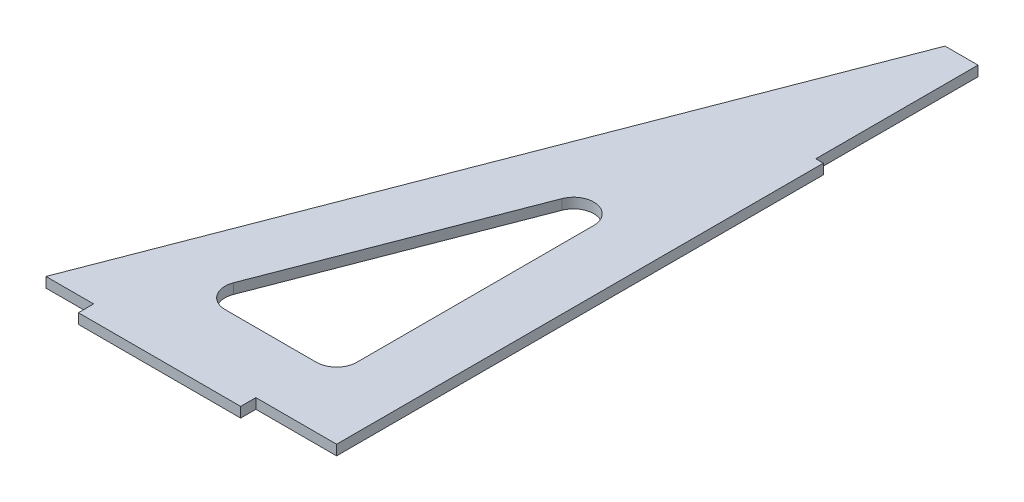
ISO-10303-21;
HEADER;
FILE_DESCRIPTION(('STEP AP214'),'2;1');
FILE_NAME('part.step','',(''),(''),'','','');
FILE_SCHEMA(('AUTOMOTIVE_DESIGN { 1 0 10303 214 1 1 1 1 }'));
ENDSEC;
DATA;
#1=APPLICATION_CONTEXT('core data for automotive mechanical design processes');
#2=APPLICATION_PROTOCOL_DEFINITION('international standard','automotive_design',2000,#1);
#3=PRODUCT_CONTEXT('',#1,'mechanical');
#4=PRODUCT('Part','Part','',(#3));
#5=PRODUCT_RELATED_PRODUCT_CATEGORY('part','',(#4));
#6=PRODUCT_DEFINITION_FORMATION('','',#4);
#7=PRODUCT_DEFINITION_CONTEXT('part definition',#1,'design');
#8=PRODUCT_DEFINITION('design','',#6,#7);
#9=PRODUCT_DEFINITION_SHAPE('','',#8);
#10=(LENGTH_UNIT() NAMED_UNIT(*) SI_UNIT(.MILLI.,.METRE.));
#11=(NAMED_UNIT(*) PLANE_ANGLE_UNIT() SI_UNIT($,.RADIAN.));
#12=(NAMED_UNIT(*) SI_UNIT($,.STERADIAN.) SOLID_ANGLE_UNIT());
#13=UNCERTAINTY_MEASURE_WITH_UNIT(LENGTH_MEASURE(1.E-05),#10,'distance_accuracy_value','');
#14=(GEOMETRIC_REPRESENTATION_CONTEXT(3) GLOBAL_UNCERTAINTY_ASSIGNED_CONTEXT((#13)) GLOBAL_UNIT_ASSIGNED_CONTEXT((#10,
#11,#12)) REPRESENTATION_CONTEXT('',''));
#15=CARTESIAN_POINT('',(0.,0.,0.));
#16=DIRECTION('',(0.,0.,1.));
#17=DIRECTION('',(1.,0.,0.));
#18=AXIS2_PLACEMENT_3D('',#15,#16,#17);
#19=CARTESIAN_POINT('',(0.,3.175,0.));
#20=DIRECTION('',(0.,0.,-1.));
#21=DIRECTION('',(-1.,0.,0.));
#22=AXIS2_PLACEMENT_3D('',#19,#20,#21);
#23=PLANE('',#22);
#24=DIRECTION('',(0.,1.,0.));
#25=VECTOR('',#24,1.);
#26=CARTESIAN_POINT('',(-25.273,0.,0.));
#27=LINE('',#26,#25);
#28=CARTESIAN_POINT('',(-25.273,0.,0.));
#29=VERTEX_POINT('',#28);
#30=CARTESIAN_POINT('',(-25.273,3.175,0.));
#31=VERTEX_POINT('',#30);
#32=EDGE_CURVE('E276',#29,#31,#27,.T.);
#33=ORIENTED_EDGE('',*,*,#32,.F.);
#34=DIRECTION('',(1.,0.,0.));
#35=VECTOR('',#34,1.);
#36=CARTESIAN_POINT('',(0.,0.,0.));
#37=LINE('',#36,#35);
#38=CARTESIAN_POINT('',(0.,0.,0.));
#39=VERTEX_POINT('',#38);
#40=EDGE_CURVE('E177',#29,#39,#37,.T.);
#41=ORIENTED_EDGE('',*,*,#40,.T.);
#42=DIRECTION('',(0.,-1.,0.));
#43=VECTOR('',#42,1.);
#44=CARTESIAN_POINT('',(0.,3.175,0.));
#45=LINE('',#44,#43);
#46=CARTESIAN_POINT('',(0.,3.175,0.));
#47=VERTEX_POINT('',#46);
#48=EDGE_CURVE('E187',#47,#39,#45,.T.);
#49=ORIENTED_EDGE('',*,*,#48,.F.);
#50=DIRECTION('',(1.,0.,0.));
#51=VECTOR('',#50,1.);
#52=CARTESIAN_POINT('',(0.,3.175,0.));
#53=LINE('',#52,#51);
#54=EDGE_CURVE('E63',#31,#47,#53,.T.);
#55=ORIENTED_EDGE('',*,*,#54,.F.);
#56=EDGE_LOOP('',(#33,#41,#49,#55));
#57=FACE_BOUND('',#56,.T.);
#58=ADVANCED_FACE('F40',(#57),#23,.F.);
#59=DIRECTION('',(0.,-1.,0.));
#60=VECTOR('',#59,1.);
#61=CARTESIAN_POINT('',(-76.073,0.,0.));
#62=LINE('',#61,#60);
#63=CARTESIAN_POINT('',(-76.073,3.175,0.));
#64=VERTEX_POINT('',#63);
#65=CARTESIAN_POINT('',(-76.073,0.,0.));
#66=VERTEX_POINT('',#65);
#67=EDGE_CURVE('E278',#64,#66,#62,.T.);
#68=ORIENTED_EDGE('',*,*,#67,.F.);
#69=CARTESIAN_POINT('',(-90.9828,3.175,0.));
#70=VERTEX_POINT('',#69);
#71=EDGE_CURVE('E191',#70,#64,#53,.T.);
#72=ORIENTED_EDGE('',*,*,#71,.F.);
#73=DIRECTION('',(0.,-1.,0.));
#74=VECTOR('',#73,1.);
#75=CARTESIAN_POINT('',(-90.9828,3.175,0.));
#76=LINE('',#75,#74);
#77=CARTESIAN_POINT('',(-90.9828,0.,0.));
#78=VERTEX_POINT('',#77);
#79=EDGE_CURVE('E190',#70,#78,#76,.T.);
#80=ORIENTED_EDGE('',*,*,#79,.T.);
#81=EDGE_CURVE('E184',#78,#66,#37,.T.);
#82=ORIENTED_EDGE('',*,*,#81,.T.);
#83=EDGE_LOOP('',(#68,#72,#80,#82));
#84=FACE_BOUND('',#83,.T.);
#85=ADVANCED_FACE('F320',(#84),#23,.F.);
#86=CARTESIAN_POINT('',(0.,3.175,-203.2));
#87=DIRECTION('',(-1.,0.,0.));
#88=DIRECTION('',(0.,0.,1.));
#89=AXIS2_PLACEMENT_3D('',#86,#87,#88);
#90=PLANE('',#89);
#91=DIRECTION('',(0.,0.,-1.));
#92=VECTOR('',#91,1.);
#93=CARTESIAN_POINT('',(0.,0.,-203.2));
#94=LINE('',#93,#92);
#95=CARTESIAN_POINT('',(0.,0.,-152.4));
#96=VERTEX_POINT('',#95);
#97=EDGE_CURVE('E175',#39,#96,#94,.T.);
#98=ORIENTED_EDGE('',*,*,#97,.T.);
#99=DIRECTION('',(0.,1.,0.));
#100=VECTOR('',#99,1.);
#101=CARTESIAN_POINT('',(0.,0.,-152.4));
#102=LINE('',#101,#100);
#103=CARTESIAN_POINT('',(0.,3.175,-152.4));
#104=VERTEX_POINT('',#103);
#105=EDGE_CURVE('E275',#96,#104,#102,.T.);
#106=ORIENTED_EDGE('',*,*,#105,.T.);
#107=DIRECTION('',(0.,0.,-1.));
#108=VECTOR('',#107,1.);
#109=CARTESIAN_POINT('',(0.,3.175,-203.2));
#110=LINE('',#109,#108);
#111=EDGE_CURVE('E186',#47,#104,#110,.T.);
#112=ORIENTED_EDGE('',*,*,#111,.F.);
#113=ORIENTED_EDGE('',*,*,#48,.T.);
#114=EDGE_LOOP('',(#98,#106,#112,#113));
#115=FACE_BOUND('',#114,.T.);
#116=ADVANCED_FACE('F274',(#115),#90,.F.);
#117=CARTESIAN_POINT('',(-12.7,3.175,-203.2));
#118=DIRECTION('',(0.,0.,1.));
#119=DIRECTION('',(1.,0.,0.));
#120=AXIS2_PLACEMENT_3D('',#117,#118,#119);
#121=PLANE('',#120);
#122=DIRECTION('',(-1.,0.,0.));
#123=VECTOR('',#122,1.);
#124=CARTESIAN_POINT('',(-12.7,3.175,-203.2));
#125=LINE('',#124,#123);
#126=CARTESIAN_POINT('',(-2.38125,3.175,-203.2));
#127=VERTEX_POINT('',#126);
#128=CARTESIAN_POINT('',(-12.7,3.175,-203.2));
#129=VERTEX_POINT('',#128);
#130=EDGE_CURVE('E168',#127,#129,#125,.T.);
#131=ORIENTED_EDGE('',*,*,#130,.F.);
#132=DIRECTION('',(0.,1.,0.));
#133=VECTOR('',#132,1.);
#134=CARTESIAN_POINT('',(-2.38125,0.,-203.2));
#135=LINE('',#134,#133);
#136=CARTESIAN_POINT('',(-2.38125,0.,-203.2));
#137=VERTEX_POINT('',#136);
#138=EDGE_CURVE('E155',#137,#127,#135,.T.);
#139=ORIENTED_EDGE('',*,*,#138,.F.);
#140=DIRECTION('',(-1.,0.,0.));
#141=VECTOR('',#140,1.);
#142=CARTESIAN_POINT('',(-12.7,0.,-203.2));
#143=LINE('',#142,#141);
#144=CARTESIAN_POINT('',(-12.7,0.,-203.2));
#145=VERTEX_POINT('',#144);
#146=EDGE_CURVE('E166',#137,#145,#143,.T.);
#147=ORIENTED_EDGE('',*,*,#146,.T.);
#148=DIRECTION('',(0.,-1.,0.));
#149=VECTOR('',#148,1.);
#150=CARTESIAN_POINT('',(-12.7,3.175,-203.2));
#151=LINE('',#150,#149);
#152=EDGE_CURVE('E194',#129,#145,#151,.T.);
#153=ORIENTED_EDGE('',*,*,#152,.F.);
#154=EDGE_LOOP('',(#131,#139,#147,#153));
#155=FACE_BOUND('',#154,.T.);
#156=ADVANCED_FACE('F164',(#155),#121,.F.);
#157=CARTESIAN_POINT('',(-90.9828,3.175,0.));
#158=DIRECTION('',(0.933147049637151,0.,0.359494900872712));
#159=DIRECTION('',(0.359494900872712,0.,-0.933147049637151));
#160=AXIS2_PLACEMENT_3D('',#157,#158,#159);
#161=PLANE('',#160);
#162=DIRECTION('',(-0.359494900872712,0.,0.933147049637151));
#163=VECTOR('',#162,1.);
#164=CARTESIAN_POINT('',(-90.9828,0.,0.));
#165=LINE('',#164,#163);
#166=EDGE_CURVE('E174',#145,#78,#165,.T.);
#167=ORIENTED_EDGE('',*,*,#166,.T.);
#168=ORIENTED_EDGE('',*,*,#79,.F.);
#169=DIRECTION('',(-0.359494900872712,0.,0.933147049637151));
#170=VECTOR('',#169,1.);
#171=CARTESIAN_POINT('',(-90.9828,3.175,0.));
#172=LINE('',#171,#170);
#173=EDGE_CURVE('E261',#129,#70,#172,.T.);
#174=ORIENTED_EDGE('',*,*,#173,.F.);
#175=ORIENTED_EDGE('',*,*,#152,.T.);
#176=EDGE_LOOP('',(#167,#168,#174,#175));
#177=FACE_BOUND('',#176,.T.);
#178=ADVANCED_FACE('F318',(#177),#161,.F.);
#179=CARTESIAN_POINT('',(0.,3.175,0.));
#180=DIRECTION('',(0.,-1.,0.));
#181=DIRECTION('',(0.,0.,-1.));
#182=AXIS2_PLACEMENT_3D('',#179,#180,#181);
#183=PLANE('',#182);
#184=DIRECTION('',(0.,0.,-1.));
#185=VECTOR('',#184,1.);
#186=CARTESIAN_POINT('',(-19.05,3.175,-19.05));
#187=LINE('',#186,#185);
#188=CARTESIAN_POINT('',(-19.05,3.175,-25.4));
#189=VERTEX_POINT('',#188);
#190=CARTESIAN_POINT('',(-19.05,3.175,-99.579705414566));
#191=VERTEX_POINT('',#190);
#192=EDGE_CURVE('E237',#189,#191,#187,.T.);
#193=ORIENTED_EDGE('',*,*,#192,.F.);
#194=CARTESIAN_POINT('',(-25.4,3.175,-25.4));
#195=DIRECTION('',(0.,-1.,0.));
#196=DIRECTION('',(0.,0.,-1.));
#197=AXIS2_PLACEMENT_3D('',#194,#195,#196);
#198=CIRCLE('',#197,6.35);
#199=CARTESIAN_POINT('',(-25.4,3.175,-19.05));
#200=VERTEX_POINT('',#199);
#201=EDGE_CURVE('E215',#189,#200,#198,.T.);
#202=ORIENTED_EDGE('',*,*,#201,.T.);
#203=DIRECTION('',(1.,0.,0.));
#204=VECTOR('',#203,1.);
#205=CARTESIAN_POINT('',(-63.2289986332212,3.175,-19.05));
#206=LINE('',#205,#204);
#207=CARTESIAN_POINT('',(-53.9777315109615,3.175,-19.05));
#208=VERTEX_POINT('',#207);
#209=EDGE_CURVE('E227',#208,#200,#206,.T.);
#210=ORIENTED_EDGE('',*,*,#209,.F.);
#211=CARTESIAN_POINT('',(-53.9777315109615,3.175,-25.4));
#212=DIRECTION('',(0.,-1.,0.));
#213=DIRECTION('',(0.,0.,-1.));
#214=AXIS2_PLACEMENT_3D('',#211,#212,#213);
#215=CIRCLE('',#214,6.35);
#216=CARTESIAN_POINT('',(-59.9032152761575,3.175,-27.6827926205417));
#217=VERTEX_POINT('',#216);
#218=EDGE_CURVE('E48',#208,#217,#215,.T.);
#219=ORIENTED_EDGE('',*,*,#218,.T.);
#220=DIRECTION('',(-0.359494900872712,0.,0.933147049637151));
#221=VECTOR('',#220,1.);
#222=CARTESIAN_POINT('',(-19.05,3.175,-133.726180748141));
#223=LINE('',#222,#221);
#224=CARTESIAN_POINT('',(-31.3254837651959,3.175,-101.862498035108));
#225=VERTEX_POINT('',#224);
#226=EDGE_CURVE('E225',#225,#217,#223,.T.);
#227=ORIENTED_EDGE('',*,*,#226,.F.);
#228=CARTESIAN_POINT('',(-25.4,3.175,-99.579705414566));
#229=DIRECTION('',(0.,-1.,0.));
#230=DIRECTION('',(0.,0.,-1.));
#231=AXIS2_PLACEMENT_3D('',#228,#229,#230);
#232=CIRCLE('',#231,6.35);
#233=EDGE_CURVE('E211',#225,#191,#232,.T.);
#234=ORIENTED_EDGE('',*,*,#233,.T.);
#235=EDGE_LOOP('',(#193,#202,#210,#219,#227,#234));
#236=FACE_BOUND('',#235,.T.);
#237=ORIENTED_EDGE('',*,*,#111,.T.);
#238=DIRECTION('',(1.,0.,0.));
#239=VECTOR('',#238,1.);
#240=CARTESIAN_POINT('',(0.,3.175,-152.4));
#241=LINE('',#240,#239);
#242=CARTESIAN_POINT('',(-2.38124999999999,3.175,-152.4));
#243=VERTEX_POINT('',#242);
#244=EDGE_CURVE('E160',#243,#104,#241,.T.);
#245=ORIENTED_EDGE('',*,*,#244,.F.);
#246=DIRECTION('',(0.,0.,1.));
#247=VECTOR('',#246,1.);
#248=CARTESIAN_POINT('',(-2.38125,3.175,-203.2));
#249=LINE('',#248,#247);
#250=EDGE_CURVE('E313',#127,#243,#249,.T.);
#251=ORIENTED_EDGE('',*,*,#250,.F.);
#252=ORIENTED_EDGE('',*,*,#130,.T.);
#253=ORIENTED_EDGE('',*,*,#173,.T.);
#254=ORIENTED_EDGE('',*,*,#71,.T.);
#255=DIRECTION('',(0.,0.,-1.));
#256=VECTOR('',#255,1.);
#257=CARTESIAN_POINT('',(-76.073,3.175,4.7625));
#258=LINE('',#257,#256);
#259=CARTESIAN_POINT('',(-76.073,3.175,4.7625));
#260=VERTEX_POINT('',#259);
#261=EDGE_CURVE('E300',#260,#64,#258,.T.);
#262=ORIENTED_EDGE('',*,*,#261,.F.);
#263=DIRECTION('',(-1.,0.,0.));
#264=VECTOR('',#263,1.);
#265=CARTESIAN_POINT('',(-76.073,3.175,4.7625));
#266=LINE('',#265,#264);
#267=CARTESIAN_POINT('',(-25.273,3.175,4.7625));
#268=VERTEX_POINT('',#267);
#269=EDGE_CURVE('E287',#268,#260,#266,.T.);
#270=ORIENTED_EDGE('',*,*,#269,.F.);
#271=DIRECTION('',(0.,0.,-1.));
#272=VECTOR('',#271,1.);
#273=CARTESIAN_POINT('',(-25.273,3.175,4.7625));
#274=LINE('',#273,#272);
#275=EDGE_CURVE('E251',#268,#31,#274,.T.);
#276=ORIENTED_EDGE('',*,*,#275,.T.);
#277=ORIENTED_EDGE('',*,*,#54,.T.);
#278=EDGE_LOOP('',(#237,#245,#251,#252,#253,#254,#262,#270,#276,#277));
#279=FACE_BOUND('',#278,.T.);
#280=ADVANCED_FACE('F223',(#236,#279),#183,.F.);
#281=CARTESIAN_POINT('',(0.,0.,0.));
#282=DIRECTION('',(0.,-1.,0.));
#283=DIRECTION('',(0.,0.,-1.));
#284=AXIS2_PLACEMENT_3D('',#281,#282,#283);
#285=PLANE('',#284);
#286=DIRECTION('',(1.,0.,0.));
#287=VECTOR('',#286,1.);
#288=CARTESIAN_POINT('',(0.,0.,-152.4));
#289=LINE('',#288,#287);
#290=CARTESIAN_POINT('',(-2.38124999999999,0.,-152.4));
#291=VERTEX_POINT('',#290);
#292=EDGE_CURVE('E55',#291,#96,#289,.T.);
#293=ORIENTED_EDGE('',*,*,#292,.T.);
#294=ORIENTED_EDGE('',*,*,#97,.F.);
#295=ORIENTED_EDGE('',*,*,#40,.F.);
#296=DIRECTION('',(0.,0.,-1.));
#297=VECTOR('',#296,1.);
#298=CARTESIAN_POINT('',(-25.273,0.,4.7625));
#299=LINE('',#298,#297);
#300=CARTESIAN_POINT('',(-25.273,0.,4.7625));
#301=VERTEX_POINT('',#300);
#302=EDGE_CURVE('E292',#301,#29,#299,.T.);
#303=ORIENTED_EDGE('',*,*,#302,.F.);
#304=DIRECTION('',(1.,0.,0.));
#305=VECTOR('',#304,1.);
#306=CARTESIAN_POINT('',(-76.073,0.,4.7625));
#307=LINE('',#306,#305);
#308=CARTESIAN_POINT('',(-76.073,0.,4.7625));
#309=VERTEX_POINT('',#308);
#310=EDGE_CURVE('E291',#309,#301,#307,.T.);
#311=ORIENTED_EDGE('',*,*,#310,.F.);
#312=DIRECTION('',(0.,0.,-1.));
#313=VECTOR('',#312,1.);
#314=CARTESIAN_POINT('',(-76.073,0.,4.7625));
#315=LINE('',#314,#313);
#316=EDGE_CURVE('E298',#309,#66,#315,.T.);
#317=ORIENTED_EDGE('',*,*,#316,.T.);
#318=ORIENTED_EDGE('',*,*,#81,.F.);
#319=ORIENTED_EDGE('',*,*,#166,.F.);
#320=ORIENTED_EDGE('',*,*,#146,.F.);
#321=DIRECTION('',(0.,0.,1.));
#322=VECTOR('',#321,1.);
#323=CARTESIAN_POINT('',(-2.38125,0.,-203.2));
#324=LINE('',#323,#322);
#325=EDGE_CURVE('E151',#137,#291,#324,.T.);
#326=ORIENTED_EDGE('',*,*,#325,.T.);
#327=EDGE_LOOP('',(#293,#294,#295,#303,#311,#317,#318,#319,#320,#326));
#328=FACE_BOUND('',#327,.T.);
#329=DIRECTION('',(-0.359494900872712,0.,0.933147049637151));
#330=VECTOR('',#329,1.);
#331=CARTESIAN_POINT('',(-19.05,0.,-133.726180748141));
#332=LINE('',#331,#330);
#333=CARTESIAN_POINT('',(-31.3254837651959,0.,-101.862498035108));
#334=VERTEX_POINT('',#333);
#335=CARTESIAN_POINT('',(-59.9032152761575,0.,-27.6827926205417));
#336=VERTEX_POINT('',#335);
#337=EDGE_CURVE('E180',#334,#336,#332,.T.);
#338=ORIENTED_EDGE('',*,*,#337,.T.);
#339=CARTESIAN_POINT('',(-53.9777315109615,0.,-25.4));
#340=DIRECTION('',(0.,-1.,0.));
#341=DIRECTION('',(0.,0.,-1.));
#342=AXIS2_PLACEMENT_3D('',#339,#340,#341);
#343=CIRCLE('',#342,6.35);
#344=CARTESIAN_POINT('',(-53.9777315109615,0.,-19.05));
#345=VERTEX_POINT('',#344);
#346=EDGE_CURVE('E11',#336,#345,#343,.F.);
#347=ORIENTED_EDGE('',*,*,#346,.T.);
#348=DIRECTION('',(1.,0.,0.));
#349=VECTOR('',#348,1.);
#350=CARTESIAN_POINT('',(-63.2289986332212,0.,-19.05));
#351=LINE('',#350,#349);
#352=CARTESIAN_POINT('',(-25.4,0.,-19.05));
#353=VERTEX_POINT('',#352);
#354=EDGE_CURVE('E236',#345,#353,#351,.T.);
#355=ORIENTED_EDGE('',*,*,#354,.T.);
#356=CARTESIAN_POINT('',(-25.4,0.,-25.4));
#357=DIRECTION('',(0.,-1.,0.));
#358=DIRECTION('',(0.,0.,-1.));
#359=AXIS2_PLACEMENT_3D('',#356,#357,#358);
#360=CIRCLE('',#359,6.35);
#361=CARTESIAN_POINT('',(-19.05,0.,-25.4));
#362=VERTEX_POINT('',#361);
#363=EDGE_CURVE('E217',#353,#362,#360,.F.);
#364=ORIENTED_EDGE('',*,*,#363,.T.);
#365=DIRECTION('',(0.,0.,-1.));
#366=VECTOR('',#365,1.);
#367=CARTESIAN_POINT('',(-19.05,0.,-19.05));
#368=LINE('',#367,#366);
#369=CARTESIAN_POINT('',(-19.05,0.,-99.579705414566));
#370=VERTEX_POINT('',#369);
#371=EDGE_CURVE('E246',#362,#370,#368,.T.);
#372=ORIENTED_EDGE('',*,*,#371,.T.);
#373=CARTESIAN_POINT('',(-25.4,0.,-99.579705414566));
#374=DIRECTION('',(0.,-1.,0.));
#375=DIRECTION('',(0.,0.,-1.));
#376=AXIS2_PLACEMENT_3D('',#373,#374,#375);
#377=CIRCLE('',#376,6.35);
#378=EDGE_CURVE('E213',#370,#334,#377,.F.);
#379=ORIENTED_EDGE('',*,*,#378,.T.);
#380=EDGE_LOOP('',(#338,#347,#355,#364,#372,#379));
#381=FACE_BOUND('',#380,.T.);
#382=ADVANCED_FACE('F171',(#328,#381),#285,.T.);
#383=CARTESIAN_POINT('',(-63.2289986332212,0.,-19.05));
#384=DIRECTION('',(0.,0.,1.));
#385=DIRECTION('',(1.,0.,0.));
#386=AXIS2_PLACEMENT_3D('',#383,#384,#385);
#387=PLANE('',#386);
#388=ORIENTED_EDGE('',*,*,#209,.T.);
#389=DIRECTION('',(0.,1.,0.));
#390=VECTOR('',#389,1.);
#391=CARTESIAN_POINT('',(-25.4,0.,-19.05));
#392=LINE('',#391,#390);
#393=EDGE_CURVE('E209',#200,#353,#392,.F.);
#394=ORIENTED_EDGE('',*,*,#393,.T.);
#395=ORIENTED_EDGE('',*,*,#354,.F.);
#396=DIRECTION('',(0.,1.,0.));
#397=VECTOR('',#396,1.);
#398=CARTESIAN_POINT('',(-53.9777315109615,3.175,-19.05));
#399=LINE('',#398,#397);
#400=EDGE_CURVE('E206',#345,#208,#399,.T.);
#401=ORIENTED_EDGE('',*,*,#400,.T.);
#402=EDGE_LOOP('',(#388,#394,#395,#401));
#403=FACE_BOUND('',#402,.T.);
#404=ADVANCED_FACE('F244',(#403),#387,.F.);
#405=CARTESIAN_POINT('',(-19.05,0.,-133.726180748141));
#406=DIRECTION('',(-0.933147049637151,0.,-0.359494900872712));
#407=DIRECTION('',(-0.359494900872712,0.,0.933147049637151));
#408=AXIS2_PLACEMENT_3D('',#405,#406,#407);
#409=PLANE('',#408);
#410=ORIENTED_EDGE('',*,*,#337,.F.);
#411=DIRECTION('',(0.,1.,0.));
#412=VECTOR('',#411,1.);
#413=CARTESIAN_POINT('',(-31.3254837651959,3.175,-101.862498035108));
#414=LINE('',#413,#412);
#415=EDGE_CURVE('E198',#334,#225,#414,.T.);
#416=ORIENTED_EDGE('',*,*,#415,.T.);
#417=ORIENTED_EDGE('',*,*,#226,.T.);
#418=DIRECTION('',(0.,1.,0.));
#419=VECTOR('',#418,1.);
#420=CARTESIAN_POINT('',(-59.9032152761574,0.,-27.6827926205417));
#421=LINE('',#420,#419);
#422=EDGE_CURVE('E196',#217,#336,#421,.F.);
#423=ORIENTED_EDGE('',*,*,#422,.T.);
#424=EDGE_LOOP('',(#410,#416,#417,#423));
#425=FACE_BOUND('',#424,.T.);
#426=ADVANCED_FACE('F233',(#425),#409,.F.);
#427=CARTESIAN_POINT('',(-19.05,0.,-19.05));
#428=DIRECTION('',(1.,0.,0.));
#429=DIRECTION('',(0.,0.,-1.));
#430=AXIS2_PLACEMENT_3D('',#427,#428,#429);
#431=PLANE('',#430);
#432=ORIENTED_EDGE('',*,*,#192,.T.);
#433=DIRECTION('',(0.,1.,0.));
#434=VECTOR('',#433,1.);
#435=CARTESIAN_POINT('',(-19.05,0.,-99.579705414566));
#436=LINE('',#435,#434);
#437=EDGE_CURVE('E204',#191,#370,#436,.F.);
#438=ORIENTED_EDGE('',*,*,#437,.T.);
#439=ORIENTED_EDGE('',*,*,#371,.F.);
#440=DIRECTION('',(0.,1.,0.));
#441=VECTOR('',#440,1.);
#442=CARTESIAN_POINT('',(-19.05,3.175,-25.4));
#443=LINE('',#442,#441);
#444=EDGE_CURVE('E201',#362,#189,#443,.T.);
#445=ORIENTED_EDGE('',*,*,#444,.T.);
#446=EDGE_LOOP('',(#432,#438,#439,#445));
#447=FACE_BOUND('',#446,.T.);
#448=ADVANCED_FACE('F339',(#447),#431,.F.);
#449=CARTESIAN_POINT('',(-25.4,0.,-99.579705414566));
#450=DIRECTION('',(0.,-1.,0.));
#451=DIRECTION('',(0.,0.,-1.));
#452=AXIS2_PLACEMENT_3D('',#449,#450,#451);
#453=CYLINDRICAL_SURFACE('',#452,6.35);
#454=ORIENTED_EDGE('',*,*,#378,.F.);
#455=ORIENTED_EDGE('',*,*,#437,.F.);
#456=ORIENTED_EDGE('',*,*,#233,.F.);
#457=ORIENTED_EDGE('',*,*,#415,.F.);
#458=EDGE_LOOP('',(#454,#455,#456,#457));
#459=FACE_BOUND('',#458,.T.);
#460=ADVANCED_FACE('F336',(#459),#453,.F.);
#461=CARTESIAN_POINT('',(-25.4,0.,-25.4));
#462=DIRECTION('',(0.,-1.,0.));
#463=DIRECTION('',(0.,0.,-1.));
#464=AXIS2_PLACEMENT_3D('',#461,#462,#463);
#465=CYLINDRICAL_SURFACE('',#464,6.35);
#466=ORIENTED_EDGE('',*,*,#363,.F.);
#467=ORIENTED_EDGE('',*,*,#393,.F.);
#468=ORIENTED_EDGE('',*,*,#201,.F.);
#469=ORIENTED_EDGE('',*,*,#444,.F.);
#470=EDGE_LOOP('',(#466,#467,#468,#469));
#471=FACE_BOUND('',#470,.T.);
#472=ADVANCED_FACE('F338',(#471),#465,.F.);
#473=CARTESIAN_POINT('',(-53.9777315109615,0.,-25.4));
#474=DIRECTION('',(0.,-1.,0.));
#475=DIRECTION('',(0.,0.,-1.));
#476=AXIS2_PLACEMENT_3D('',#473,#474,#475);
#477=CYLINDRICAL_SURFACE('',#476,6.35);
#478=ORIENTED_EDGE('',*,*,#346,.F.);
#479=ORIENTED_EDGE('',*,*,#422,.F.);
#480=ORIENTED_EDGE('',*,*,#218,.F.);
#481=ORIENTED_EDGE('',*,*,#400,.F.);
#482=EDGE_LOOP('',(#478,#479,#480,#481));
#483=FACE_BOUND('',#482,.T.);
#484=ADVANCED_FACE('F42',(#483),#477,.F.);
#485=CARTESIAN_POINT('',(-25.273,0.,4.7625));
#486=DIRECTION('',(-1.,0.,0.));
#487=DIRECTION('',(0.,0.,1.));
#488=AXIS2_PLACEMENT_3D('',#485,#486,#487);
#489=PLANE('',#488);
#490=ORIENTED_EDGE('',*,*,#32,.T.);
#491=ORIENTED_EDGE('',*,*,#275,.F.);
#492=DIRECTION('',(0.,1.,0.));
#493=VECTOR('',#492,1.);
#494=CARTESIAN_POINT('',(-25.273,0.,4.7625));
#495=LINE('',#494,#493);
#496=EDGE_CURVE('E284',#301,#268,#495,.T.);
#497=ORIENTED_EDGE('',*,*,#496,.F.);
#498=ORIENTED_EDGE('',*,*,#302,.T.);
#499=EDGE_LOOP('',(#490,#491,#497,#498));
#500=FACE_BOUND('',#499,.T.);
#501=ADVANCED_FACE('F311',(#500),#489,.F.);
#502=CARTESIAN_POINT('',(-76.073,0.,4.7625));
#503=DIRECTION('',(1.,0.,0.));
#504=DIRECTION('',(0.,0.,-1.));
#505=AXIS2_PLACEMENT_3D('',#502,#503,#504);
#506=PLANE('',#505);
#507=ORIENTED_EDGE('',*,*,#67,.T.);
#508=ORIENTED_EDGE('',*,*,#316,.F.);
#509=DIRECTION('',(0.,-1.,0.));
#510=VECTOR('',#509,1.);
#511=CARTESIAN_POINT('',(-76.073,0.,4.7625));
#512=LINE('',#511,#510);
#513=EDGE_CURVE('E289',#260,#309,#512,.T.);
#514=ORIENTED_EDGE('',*,*,#513,.F.);
#515=ORIENTED_EDGE('',*,*,#261,.T.);
#516=EDGE_LOOP('',(#507,#508,#514,#515));
#517=FACE_BOUND('',#516,.T.);
#518=ADVANCED_FACE('F303',(#517),#506,.F.);
#519=CARTESIAN_POINT('',(0.,0.,4.7625));
#520=DIRECTION('',(0.,0.,-1.));
#521=DIRECTION('',(-1.,0.,0.));
#522=AXIS2_PLACEMENT_3D('',#519,#520,#521);
#523=PLANE('',#522);
#524=ORIENTED_EDGE('',*,*,#496,.T.);
#525=ORIENTED_EDGE('',*,*,#269,.T.);
#526=ORIENTED_EDGE('',*,*,#513,.T.);
#527=ORIENTED_EDGE('',*,*,#310,.T.);
#528=EDGE_LOOP('',(#524,#525,#526,#527));
#529=FACE_BOUND('',#528,.T.);
#530=ADVANCED_FACE('F307',(#529),#523,.F.);
#531=CARTESIAN_POINT('',(0.,0.,-152.4));
#532=DIRECTION('',(0.,0.,1.));
#533=DIRECTION('',(1.,0.,0.));
#534=AXIS2_PLACEMENT_3D('',#531,#532,#533);
#535=PLANE('',#534);
#536=ORIENTED_EDGE('',*,*,#244,.T.);
#537=ORIENTED_EDGE('',*,*,#105,.F.);
#538=ORIENTED_EDGE('',*,*,#292,.F.);
#539=DIRECTION('',(0.,1.,0.));
#540=VECTOR('',#539,1.);
#541=CARTESIAN_POINT('',(-2.38124999999999,0.,-152.4));
#542=LINE('',#541,#540);
#543=EDGE_CURVE('E157',#291,#243,#542,.T.);
#544=ORIENTED_EDGE('',*,*,#543,.T.);
#545=EDGE_LOOP('',(#536,#537,#538,#544));
#546=FACE_BOUND('',#545,.T.);
#547=ADVANCED_FACE('F314',(#546),#535,.F.);
#548=CARTESIAN_POINT('',(-2.38125,0.,-203.2));
#549=DIRECTION('',(-1.,0.,0.));
#550=DIRECTION('',(0.,0.,1.));
#551=AXIS2_PLACEMENT_3D('',#548,#549,#550);
#552=PLANE('',#551);
#553=ORIENTED_EDGE('',*,*,#250,.T.);
#554=ORIENTED_EDGE('',*,*,#543,.F.);
#555=ORIENTED_EDGE('',*,*,#325,.F.);
#556=ORIENTED_EDGE('',*,*,#138,.T.);
#557=EDGE_LOOP('',(#553,#554,#555,#556));
#558=FACE_BOUND('',#557,.T.);
#559=ADVANCED_FACE('F154',(#558),#552,.F.);
#560=CLOSED_SHELL('',(#58,#85,#116,#156,#178,#280,#382,#404,#426,#448,#460,#472,#484,#501,#518,
#530,#547,#559));
#561=MANIFOLD_SOLID_BREP('B2',#560);
#562=ADVANCED_BREP_SHAPE_REPRESENTATION('',(#18,#561),#14);
#563=SHAPE_DEFINITION_REPRESENTATION(#9,#562);
ENDSEC;
END-ISO-10303-21;
